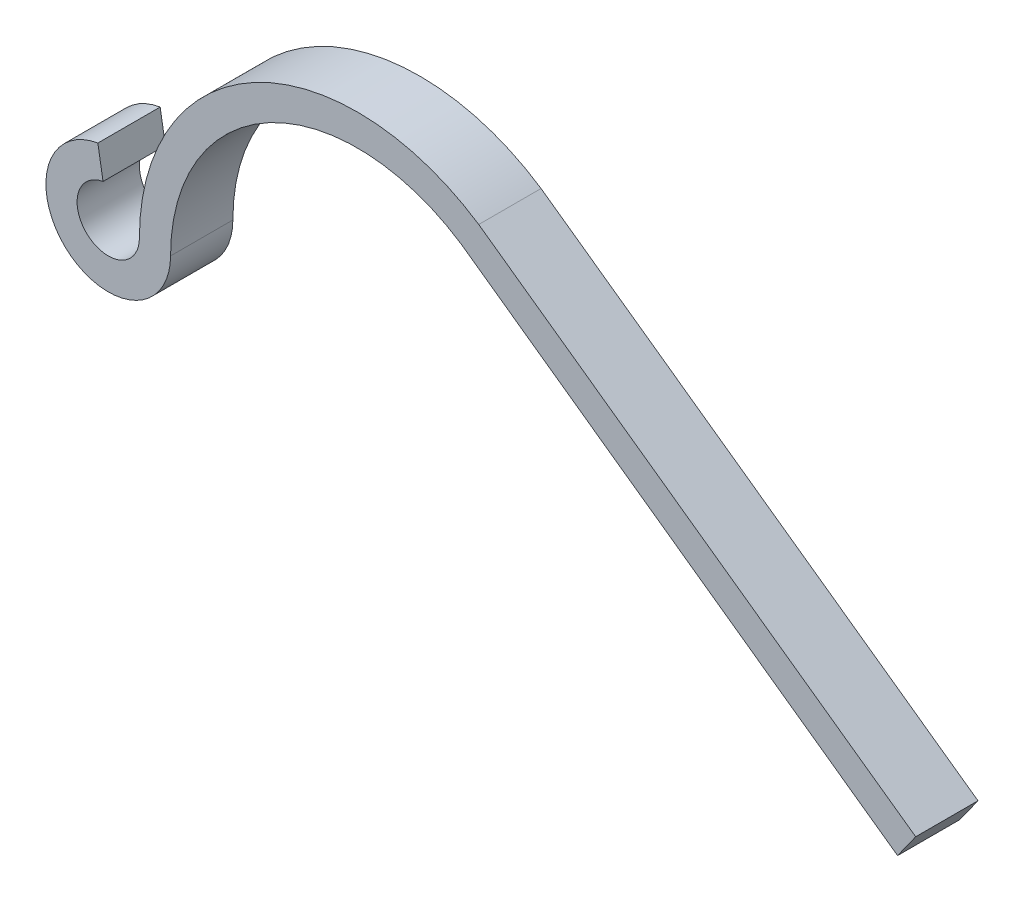
ISO-10303-21;
HEADER;
FILE_DESCRIPTION(('STEP AP214'),'2;1');
FILE_NAME('part.step','',(''),(''),'','','');
FILE_SCHEMA(('AUTOMOTIVE_DESIGN { 1 0 10303 214 1 1 1 1 }'));
ENDSEC;
DATA;
#1=APPLICATION_CONTEXT('core data for automotive mechanical design processes');
#2=APPLICATION_PROTOCOL_DEFINITION('international standard','automotive_design',2000,#1);
#3=PRODUCT_CONTEXT('',#1,'mechanical');
#4=PRODUCT('Part','Part','',(#3));
#5=PRODUCT_RELATED_PRODUCT_CATEGORY('part','',(#4));
#6=PRODUCT_DEFINITION_FORMATION('','',#4);
#7=PRODUCT_DEFINITION_CONTEXT('part definition',#1,'design');
#8=PRODUCT_DEFINITION('design','',#6,#7);
#9=PRODUCT_DEFINITION_SHAPE('','',#8);
#10=(LENGTH_UNIT() NAMED_UNIT(*) SI_UNIT(.MILLI.,.METRE.));
#11=(NAMED_UNIT(*) PLANE_ANGLE_UNIT() SI_UNIT($,.RADIAN.));
#12=(NAMED_UNIT(*) SI_UNIT($,.STERADIAN.) SOLID_ANGLE_UNIT());
#13=UNCERTAINTY_MEASURE_WITH_UNIT(LENGTH_MEASURE(1.E-05),#10,'distance_accuracy_value','');
#14=(GEOMETRIC_REPRESENTATION_CONTEXT(3) GLOBAL_UNCERTAINTY_ASSIGNED_CONTEXT((#13)) GLOBAL_UNIT_ASSIGNED_CONTEXT((#10,
#11,#12)) REPRESENTATION_CONTEXT('',''));
#15=CARTESIAN_POINT('',(0.,0.,0.));
#16=DIRECTION('',(0.,0.,1.));
#17=DIRECTION('',(1.,0.,0.));
#18=AXIS2_PLACEMENT_3D('',#15,#16,#17);
#19=CARTESIAN_POINT('',(0.,0.,10.));
#20=DIRECTION('',(0.,0.,-1.));
#21=DIRECTION('',(-1.,0.,0.));
#22=AXIS2_PLACEMENT_3D('',#19,#20,#21);
#23=CYLINDRICAL_SURFACE('',#22,30.);
#24=CARTESIAN_POINT('',(0.,0.,0.));
#25=DIRECTION('',(0.,0.,-1.));
#26=DIRECTION('',(-1.,0.,0.));
#27=AXIS2_PLACEMENT_3D('',#24,#25,#26);
#28=CIRCLE('',#27,30.);
#29=CARTESIAN_POINT('',(-30.,0.,0.));
#30=VERTEX_POINT('',#29);
#31=CARTESIAN_POINT('',(16.612346593833,24.9805912789583,0.));
#32=VERTEX_POINT('',#31);
#33=EDGE_CURVE('E110',#30,#32,#28,.T.);
#34=ORIENTED_EDGE('',*,*,#33,.T.);
#35=DIRECTION('',(0.,0.,-1.));
#36=VECTOR('',#35,1.);
#37=CARTESIAN_POINT('',(16.612346593833,24.9805912789583,10.));
#38=LINE('',#37,#36);
#39=CARTESIAN_POINT('',(16.612346593833,24.9805912789583,10.));
#40=VERTEX_POINT('',#39);
#41=EDGE_CURVE('E11',#40,#32,#38,.T.);
#42=ORIENTED_EDGE('',*,*,#41,.F.);
#43=CARTESIAN_POINT('',(0.,0.,10.));
#44=DIRECTION('',(0.,0.,-1.));
#45=DIRECTION('',(-1.,0.,0.));
#46=AXIS2_PLACEMENT_3D('',#43,#44,#45);
#47=CIRCLE('',#46,30.);
#48=CARTESIAN_POINT('',(-30.,0.,10.));
#49=VERTEX_POINT('',#48);
#50=EDGE_CURVE('E137',#49,#40,#47,.T.);
#51=ORIENTED_EDGE('',*,*,#50,.F.);
#52=DIRECTION('',(0.,0.,-1.));
#53=VECTOR('',#52,1.);
#54=CARTESIAN_POINT('',(-30.,0.,10.));
#55=LINE('',#54,#53);
#56=EDGE_CURVE('E123',#49,#30,#55,.T.);
#57=ORIENTED_EDGE('',*,*,#56,.T.);
#58=EDGE_LOOP('',(#34,#42,#51,#57));
#59=FACE_BOUND('',#58,.T.);
#60=ADVANCED_FACE('F42',(#59),#23,.F.);
#61=CARTESIAN_POINT('',(86.663223309681,-25.,10.));
#62=DIRECTION('',(0.580809134675727,0.814039771188873,0.));
#63=DIRECTION('',(-0.814039771188873,0.580809134675727,0.));
#64=AXIS2_PLACEMENT_3D('',#61,#62,#63);
#65=PLANE('',#64);
#66=DIRECTION('',(0.814039771188873,-0.580809134675728,0.));
#67=VECTOR('',#66,1.);
#68=CARTESIAN_POINT('',(86.663223309681,-25.,0.));
#69=LINE('',#68,#67);
#70=CARTESIAN_POINT('',(86.663223309681,-25.,0.));
#71=VERTEX_POINT('',#70);
#72=EDGE_CURVE('E106',#32,#71,#69,.T.);
#73=ORIENTED_EDGE('',*,*,#72,.T.);
#74=DIRECTION('',(0.,0.,-1.));
#75=VECTOR('',#74,1.);
#76=CARTESIAN_POINT('',(86.663223309681,-25.,10.));
#77=LINE('',#76,#75);
#78=CARTESIAN_POINT('',(86.663223309681,-25.,10.));
#79=VERTEX_POINT('',#78);
#80=EDGE_CURVE('E49',#79,#71,#77,.T.);
#81=ORIENTED_EDGE('',*,*,#80,.F.);
#82=DIRECTION('',(0.814039771188873,-0.580809134675728,0.));
#83=VECTOR('',#82,1.);
#84=CARTESIAN_POINT('',(86.663223309681,-25.,10.));
#85=LINE('',#84,#83);
#86=EDGE_CURVE('E119',#40,#79,#85,.T.);
#87=ORIENTED_EDGE('',*,*,#86,.F.);
#88=ORIENTED_EDGE('',*,*,#41,.T.);
#89=EDGE_LOOP('',(#73,#81,#87,#88));
#90=FACE_BOUND('',#89,.T.);
#91=ADVANCED_FACE('F118',(#90),#65,.F.);
#92=CARTESIAN_POINT('',(86.663223309681,-25.,10.));
#93=DIRECTION('',(-0.814039771188873,0.580809134675728,0.));
#94=DIRECTION('',(-0.580809134675728,-0.814039771188873,0.));
#95=AXIS2_PLACEMENT_3D('',#92,#93,#94);
#96=PLANE('',#95);
#97=DIRECTION('',(0.580809134675728,0.814039771188873,0.));
#98=VECTOR('',#97,1.);
#99=CARTESIAN_POINT('',(86.663223309681,-25.,0.));
#100=LINE('',#99,#98);
#101=CARTESIAN_POINT('',(89.5672689830596,-20.9298011440556,0.));
#102=VERTEX_POINT('',#101);
#103=EDGE_CURVE('E112',#71,#102,#100,.T.);
#104=ORIENTED_EDGE('',*,*,#103,.T.);
#105=DIRECTION('',(0.,0.,-1.));
#106=VECTOR('',#105,1.);
#107=CARTESIAN_POINT('',(89.5672689830596,-20.9298011440556,10.));
#108=LINE('',#107,#106);
#109=CARTESIAN_POINT('',(89.5672689830596,-20.9298011440556,10.));
#110=VERTEX_POINT('',#109);
#111=EDGE_CURVE('E163',#110,#102,#108,.T.);
#112=ORIENTED_EDGE('',*,*,#111,.F.);
#113=DIRECTION('',(0.580809134675728,0.814039771188873,0.));
#114=VECTOR('',#113,1.);
#115=CARTESIAN_POINT('',(86.663223309681,-25.,10.));
#116=LINE('',#115,#114);
#117=EDGE_CURVE('E140',#79,#110,#116,.T.);
#118=ORIENTED_EDGE('',*,*,#117,.F.);
#119=ORIENTED_EDGE('',*,*,#80,.T.);
#120=EDGE_LOOP('',(#104,#112,#118,#119));
#121=FACE_BOUND('',#120,.T.);
#122=ADVANCED_FACE('F167',(#121),#96,.F.);
#123=CARTESIAN_POINT('',(89.5672689830596,-20.9298011440556,10.));
#124=DIRECTION('',(-0.580809134675727,-0.814039771188873,0.));
#125=DIRECTION('',(0.814039771188873,-0.580809134675727,0.));
#126=AXIS2_PLACEMENT_3D('',#123,#124,#125);
#127=PLANE('',#126);
#128=DIRECTION('',(-0.814039771188873,0.580809134675727,0.));
#129=VECTOR('',#128,1.);
#130=CARTESIAN_POINT('',(89.5672689830596,-20.9298011440556,0.));
#131=LINE('',#130,#129);
#132=CARTESIAN_POINT('',(19.4520751235413,29.0966797657071,0.));
#133=VERTEX_POINT('',#132);
#134=EDGE_CURVE('E127',#102,#133,#131,.T.);
#135=ORIENTED_EDGE('',*,*,#134,.T.);
#136=DIRECTION('',(0.,0.,-1.));
#137=VECTOR('',#136,1.);
#138=CARTESIAN_POINT('',(19.4520751235413,29.0966797657071,10.));
#139=LINE('',#138,#137);
#140=CARTESIAN_POINT('',(19.4520751235413,29.0966797657071,10.));
#141=VERTEX_POINT('',#140);
#142=EDGE_CURVE('E160',#141,#133,#139,.T.);
#143=ORIENTED_EDGE('',*,*,#142,.F.);
#144=DIRECTION('',(-0.814039771188873,0.580809134675727,0.));
#145=VECTOR('',#144,1.);
#146=CARTESIAN_POINT('',(89.5672689830596,-20.9298011440556,10.));
#147=LINE('',#146,#145);
#148=EDGE_CURVE('E142',#110,#141,#147,.T.);
#149=ORIENTED_EDGE('',*,*,#148,.F.);
#150=ORIENTED_EDGE('',*,*,#111,.T.);
#151=EDGE_LOOP('',(#135,#143,#149,#150));
#152=FACE_BOUND('',#151,.T.);
#153=ADVANCED_FACE('F175',(#152),#127,.F.);
#154=CARTESIAN_POINT('',(0.,0.,10.));
#155=DIRECTION('',(0.,0.,-1.));
#156=DIRECTION('',(-1.,0.,0.));
#157=AXIS2_PLACEMENT_3D('',#154,#155,#156);
#158=CYLINDRICAL_SURFACE('',#157,35.);
#159=CARTESIAN_POINT('',(0.,0.,0.));
#160=DIRECTION('',(0.,0.,1.));
#161=DIRECTION('',(-1.,0.,0.));
#162=AXIS2_PLACEMENT_3D('',#159,#160,#161);
#163=CIRCLE('',#162,35.);
#164=CARTESIAN_POINT('',(-35.,0.,0.));
#165=VERTEX_POINT('',#164);
#166=EDGE_CURVE('E129',#133,#165,#163,.T.);
#167=ORIENTED_EDGE('',*,*,#166,.T.);
#168=DIRECTION('',(0.,0.,-1.));
#169=VECTOR('',#168,1.);
#170=CARTESIAN_POINT('',(-35.,0.,10.));
#171=LINE('',#170,#169);
#172=CARTESIAN_POINT('',(-35.,0.,10.));
#173=VERTEX_POINT('',#172);
#174=EDGE_CURVE('E157',#173,#165,#171,.T.);
#175=ORIENTED_EDGE('',*,*,#174,.F.);
#176=CARTESIAN_POINT('',(0.,0.,10.));
#177=DIRECTION('',(0.,0.,1.));
#178=DIRECTION('',(-1.,0.,0.));
#179=AXIS2_PLACEMENT_3D('',#176,#177,#178);
#180=CIRCLE('',#179,35.);
#181=EDGE_CURVE('E144',#141,#173,#180,.T.);
#182=ORIENTED_EDGE('',*,*,#181,.F.);
#183=ORIENTED_EDGE('',*,*,#142,.T.);
#184=EDGE_LOOP('',(#167,#175,#182,#183));
#185=FACE_BOUND('',#184,.T.);
#186=ADVANCED_FACE('F178',(#185),#158,.T.);
#187=CARTESIAN_POINT('',(-40.,0.,10.));
#188=DIRECTION('',(0.,0.,-1.));
#189=DIRECTION('',(-1.,0.,0.));
#190=AXIS2_PLACEMENT_3D('',#187,#188,#189);
#191=CYLINDRICAL_SURFACE('',#190,5.);
#192=CARTESIAN_POINT('',(-40.,0.,0.));
#193=DIRECTION('',(0.,0.,-1.));
#194=DIRECTION('',(-1.,0.,0.));
#195=AXIS2_PLACEMENT_3D('',#192,#193,#194);
#196=CIRCLE('',#195,5.);
#197=CARTESIAN_POINT('',(-40.8333333333333,4.93006648591635,0.));
#198=VERTEX_POINT('',#197);
#199=EDGE_CURVE('E131',#165,#198,#196,.T.);
#200=ORIENTED_EDGE('',*,*,#199,.T.);
#201=DIRECTION('',(0.,0.,-1.));
#202=VECTOR('',#201,1.);
#203=CARTESIAN_POINT('',(-40.8333333333333,4.93006648591635,10.));
#204=LINE('',#203,#202);
#205=CARTESIAN_POINT('',(-40.8333333333333,4.93006648591635,10.));
#206=VERTEX_POINT('',#205);
#207=EDGE_CURVE('E154',#206,#198,#204,.T.);
#208=ORIENTED_EDGE('',*,*,#207,.F.);
#209=CARTESIAN_POINT('',(-40.,0.,10.));
#210=DIRECTION('',(0.,0.,-1.));
#211=DIRECTION('',(-1.,0.,0.));
#212=AXIS2_PLACEMENT_3D('',#209,#210,#211);
#213=CIRCLE('',#212,5.);
#214=EDGE_CURVE('E146',#173,#206,#213,.T.);
#215=ORIENTED_EDGE('',*,*,#214,.F.);
#216=ORIENTED_EDGE('',*,*,#174,.T.);
#217=EDGE_LOOP('',(#200,#208,#215,#216));
#218=FACE_BOUND('',#217,.T.);
#219=ADVANCED_FACE('F183',(#218),#191,.F.);
#220=CARTESIAN_POINT('',(-40.8333333333333,4.93006648591635,10.));
#221=DIRECTION('',(-0.986013297183269,-0.166666666666666,0.));
#222=DIRECTION('',(0.166666666666666,-0.986013297183269,0.));
#223=AXIS2_PLACEMENT_3D('',#220,#221,#222);
#224=PLANE('',#223);
#225=DIRECTION('',(-0.166666666666666,0.986013297183269,0.));
#226=VECTOR('',#225,1.);
#227=CARTESIAN_POINT('',(-40.8333333333333,4.93006648591635,0.));
#228=LINE('',#227,#226);
#229=CARTESIAN_POINT('',(-41.6666666666667,9.8601329718327,0.));
#230=VERTEX_POINT('',#229);
#231=EDGE_CURVE('E133',#198,#230,#228,.T.);
#232=ORIENTED_EDGE('',*,*,#231,.T.);
#233=DIRECTION('',(0.,0.,-1.));
#234=VECTOR('',#233,1.);
#235=CARTESIAN_POINT('',(-41.6666666666667,9.8601329718327,10.));
#236=LINE('',#235,#234);
#237=CARTESIAN_POINT('',(-41.6666666666667,9.8601329718327,10.));
#238=VERTEX_POINT('',#237);
#239=EDGE_CURVE('E151',#238,#230,#236,.T.);
#240=ORIENTED_EDGE('',*,*,#239,.F.);
#241=DIRECTION('',(-0.166666666666666,0.986013297183269,0.));
#242=VECTOR('',#241,1.);
#243=CARTESIAN_POINT('',(-40.8333333333333,4.93006648591635,10.));
#244=LINE('',#243,#242);
#245=EDGE_CURVE('E61',#206,#238,#244,.T.);
#246=ORIENTED_EDGE('',*,*,#245,.F.);
#247=ORIENTED_EDGE('',*,*,#207,.T.);
#248=EDGE_LOOP('',(#232,#240,#246,#247));
#249=FACE_BOUND('',#248,.T.);
#250=ADVANCED_FACE('F186',(#249),#224,.F.);
#251=CARTESIAN_POINT('',(-40.,0.,10.));
#252=DIRECTION('',(0.,0.,-1.));
#253=DIRECTION('',(-1.,0.,0.));
#254=AXIS2_PLACEMENT_3D('',#251,#252,#253);
#255=CYLINDRICAL_SURFACE('',#254,10.);
#256=CARTESIAN_POINT('',(-40.,0.,0.));
#257=DIRECTION('',(0.,0.,1.));
#258=DIRECTION('',(-1.,0.,0.));
#259=AXIS2_PLACEMENT_3D('',#256,#257,#258);
#260=CIRCLE('',#259,10.);
#261=EDGE_CURVE('E135',#230,#30,#260,.T.);
#262=ORIENTED_EDGE('',*,*,#261,.T.);
#263=ORIENTED_EDGE('',*,*,#56,.F.);
#264=CARTESIAN_POINT('',(-40.,0.,10.));
#265=DIRECTION('',(0.,0.,1.));
#266=DIRECTION('',(-1.,0.,0.));
#267=AXIS2_PLACEMENT_3D('',#264,#265,#266);
#268=CIRCLE('',#267,10.);
#269=EDGE_CURVE('E56',#238,#49,#268,.T.);
#270=ORIENTED_EDGE('',*,*,#269,.F.);
#271=ORIENTED_EDGE('',*,*,#239,.T.);
#272=EDGE_LOOP('',(#262,#263,#270,#271));
#273=FACE_BOUND('',#272,.T.);
#274=ADVANCED_FACE('F188',(#273),#255,.T.);
#275=CARTESIAN_POINT('',(0.,0.,10.));
#276=DIRECTION('',(0.,0.,-1.));
#277=DIRECTION('',(-1.,0.,0.));
#278=AXIS2_PLACEMENT_3D('',#275,#276,#277);
#279=PLANE('',#278);
#280=ORIENTED_EDGE('',*,*,#50,.T.);
#281=ORIENTED_EDGE('',*,*,#86,.T.);
#282=ORIENTED_EDGE('',*,*,#117,.T.);
#283=ORIENTED_EDGE('',*,*,#148,.T.);
#284=ORIENTED_EDGE('',*,*,#181,.T.);
#285=ORIENTED_EDGE('',*,*,#214,.T.);
#286=ORIENTED_EDGE('',*,*,#245,.T.);
#287=ORIENTED_EDGE('',*,*,#269,.T.);
#288=EDGE_LOOP('',(#280,#281,#282,#283,#284,#285,#286,#287));
#289=FACE_BOUND('',#288,.T.);
#290=ADVANCED_FACE('F170',(#289),#279,.F.);
#291=CARTESIAN_POINT('',(0.,0.,0.));
#292=DIRECTION('',(0.,0.,-1.));
#293=DIRECTION('',(-1.,0.,0.));
#294=AXIS2_PLACEMENT_3D('',#291,#292,#293);
#295=PLANE('',#294);
#296=ORIENTED_EDGE('',*,*,#33,.F.);
#297=ORIENTED_EDGE('',*,*,#261,.F.);
#298=ORIENTED_EDGE('',*,*,#231,.F.);
#299=ORIENTED_EDGE('',*,*,#199,.F.);
#300=ORIENTED_EDGE('',*,*,#166,.F.);
#301=ORIENTED_EDGE('',*,*,#134,.F.);
#302=ORIENTED_EDGE('',*,*,#103,.F.);
#303=ORIENTED_EDGE('',*,*,#72,.F.);
#304=EDGE_LOOP('',(#296,#297,#298,#299,#300,#301,#302,#303));
#305=FACE_BOUND('',#304,.T.);
#306=ADVANCED_FACE('F107',(#305),#295,.T.);
#307=CLOSED_SHELL('',(#60,#91,#122,#153,#186,#219,#250,#274,#290,#306));
#308=MANIFOLD_SOLID_BREP('B2',#307);
#309=ADVANCED_BREP_SHAPE_REPRESENTATION('',(#18,#308),#14);
#310=SHAPE_DEFINITION_REPRESENTATION(#9,#309);
ENDSEC;
END-ISO-10303-21;
